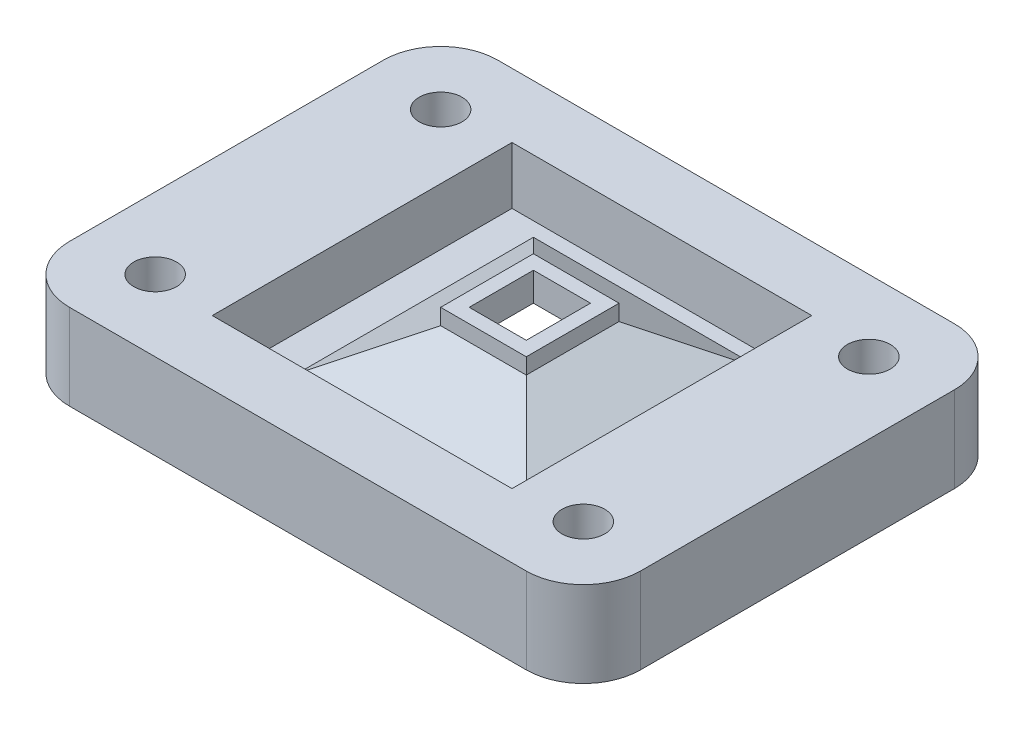
ISO-10303-21;
HEADER;
FILE_DESCRIPTION(('STEP AP214'),'2;1');
FILE_NAME('part.step','',(''),(''),'','','');
FILE_SCHEMA(('AUTOMOTIVE_DESIGN { 1 0 10303 214 1 1 1 1 }'));
ENDSEC;
DATA;
#1=APPLICATION_CONTEXT('core data for automotive mechanical design processes');
#2=APPLICATION_PROTOCOL_DEFINITION('international standard','automotive_design',2000,#1);
#3=PRODUCT_CONTEXT('',#1,'mechanical');
#4=PRODUCT('Part','Part','',(#3));
#5=PRODUCT_RELATED_PRODUCT_CATEGORY('part','',(#4));
#6=PRODUCT_DEFINITION_FORMATION('','',#4);
#7=PRODUCT_DEFINITION_CONTEXT('part definition',#1,'design');
#8=PRODUCT_DEFINITION('design','',#6,#7);
#9=PRODUCT_DEFINITION_SHAPE('','',#8);
#10=(LENGTH_UNIT() NAMED_UNIT(*) SI_UNIT(.MILLI.,.METRE.));
#11=(NAMED_UNIT(*) PLANE_ANGLE_UNIT() SI_UNIT($,.RADIAN.));
#12=(NAMED_UNIT(*) SI_UNIT($,.STERADIAN.) SOLID_ANGLE_UNIT());
#13=UNCERTAINTY_MEASURE_WITH_UNIT(LENGTH_MEASURE(1.E-05),#10,'distance_accuracy_value','');
#14=(GEOMETRIC_REPRESENTATION_CONTEXT(3) GLOBAL_UNCERTAINTY_ASSIGNED_CONTEXT((#13)) GLOBAL_UNIT_ASSIGNED_CONTEXT((#10,
#11,#12)) REPRESENTATION_CONTEXT('',''));
#15=CARTESIAN_POINT('',(0.,0.,0.));
#16=DIRECTION('',(0.,0.,1.));
#17=DIRECTION('',(1.,0.,0.));
#18=AXIS2_PLACEMENT_3D('',#15,#16,#17);
#19=CARTESIAN_POINT('',(0.,2.,0.));
#20=DIRECTION('',(0.,-1.,0.));
#21=DIRECTION('',(0.,0.,-1.));
#22=AXIS2_PLACEMENT_3D('',#19,#20,#21);
#23=PLANE('',#22);
#24=DIRECTION('',(-1.,0.,0.));
#25=VECTOR('',#24,1.);
#26=CARTESIAN_POINT('',(17.,2.,-8.00000000000003));
#27=LINE('',#26,#25);
#28=CARTESIAN_POINT('',(28.,2.,-8.00000000000003));
#29=VERTEX_POINT('',#28);
#30=CARTESIAN_POINT('',(12.,2.,-8.00000000000003));
#31=VERTEX_POINT('',#30);
#32=EDGE_CURVE('E394',#29,#31,#27,.T.);
#33=ORIENTED_EDGE('',*,*,#32,.T.);
#34=DIRECTION('',(0.,0.,-1.));
#35=VECTOR('',#34,1.);
#36=CARTESIAN_POINT('',(12.,2.,-19.5));
#37=LINE('',#36,#35);
#38=CARTESIAN_POINT('',(12.,2.,-24.5));
#39=VERTEX_POINT('',#38);
#40=EDGE_CURVE('E400',#31,#39,#37,.T.);
#41=ORIENTED_EDGE('',*,*,#40,.T.);
#42=DIRECTION('',(1.,0.,0.));
#43=VECTOR('',#42,1.);
#44=CARTESIAN_POINT('',(23.,2.,-24.5));
#45=LINE('',#44,#43);
#46=CARTESIAN_POINT('',(28.,2.,-24.5));
#47=VERTEX_POINT('',#46);
#48=EDGE_CURVE('E398',#39,#47,#45,.T.);
#49=ORIENTED_EDGE('',*,*,#48,.T.);
#50=DIRECTION('',(0.,0.,1.));
#51=VECTOR('',#50,1.);
#52=CARTESIAN_POINT('',(28.,2.,-13.));
#53=LINE('',#52,#51);
#54=EDGE_CURVE('E396',#47,#29,#53,.T.);
#55=ORIENTED_EDGE('',*,*,#54,.T.);
#56=EDGE_LOOP('',(#33,#41,#49,#55));
#57=FACE_BOUND('',#56,.T.);
#58=DIRECTION('',(0.,0.,1.));
#59=VECTOR('',#58,1.);
#60=CARTESIAN_POINT('',(9.5,2.,-4.5));
#61=LINE('',#60,#59);
#62=CARTESIAN_POINT('',(9.5,2.,-25.5));
#63=VERTEX_POINT('',#62);
#64=CARTESIAN_POINT('',(9.5,2.,-4.5));
#65=VERTEX_POINT('',#64);
#66=EDGE_CURVE('E251',#63,#65,#61,.T.);
#67=ORIENTED_EDGE('',*,*,#66,.T.);
#68=DIRECTION('',(1.,0.,0.));
#69=VECTOR('',#68,1.);
#70=CARTESIAN_POINT('',(9.5,2.,-4.5));
#71=LINE('',#70,#69);
#72=CARTESIAN_POINT('',(30.5,2.,-4.5));
#73=VERTEX_POINT('',#72);
#74=EDGE_CURVE('E254',#65,#73,#71,.T.);
#75=ORIENTED_EDGE('',*,*,#74,.T.);
#76=DIRECTION('',(0.,0.,-1.));
#77=VECTOR('',#76,1.);
#78=CARTESIAN_POINT('',(30.5,2.,-4.5));
#79=LINE('',#78,#77);
#80=CARTESIAN_POINT('',(30.5,2.,-25.5));
#81=VERTEX_POINT('',#80);
#82=EDGE_CURVE('E258',#73,#81,#79,.T.);
#83=ORIENTED_EDGE('',*,*,#82,.T.);
#84=DIRECTION('',(-1.,0.,0.));
#85=VECTOR('',#84,1.);
#86=CARTESIAN_POINT('',(9.5,2.,-25.5));
#87=LINE('',#86,#85);
#88=EDGE_CURVE('E261',#81,#63,#87,.T.);
#89=ORIENTED_EDGE('',*,*,#88,.T.);
#90=EDGE_LOOP('',(#67,#75,#83,#89));
#91=FACE_BOUND('',#90,.T.);
#92=ADVANCED_FACE('F33',(#57,#91),#23,.F.);
#93=CARTESIAN_POINT('',(0.,6.,0.));
#94=DIRECTION('',(1.,0.,0.));
#95=DIRECTION('',(0.,0.,-1.));
#96=AXIS2_PLACEMENT_3D('',#93,#94,#95);
#97=PLANE('',#96);
#98=DIRECTION('',(0.,0.,1.));
#99=VECTOR('',#98,1.);
#100=CARTESIAN_POINT('',(0.,6.,0.));
#101=LINE('',#100,#99);
#102=CARTESIAN_POINT('',(0.,6.,-26.));
#103=VERTEX_POINT('',#102);
#104=CARTESIAN_POINT('',(0.,6.,-4.));
#105=VERTEX_POINT('',#104);
#106=EDGE_CURVE('E307',#103,#105,#101,.T.);
#107=ORIENTED_EDGE('',*,*,#106,.F.);
#108=DIRECTION('',(0.,-1.,0.));
#109=VECTOR('',#108,1.);
#110=CARTESIAN_POINT('',(0.,6.,-26.));
#111=LINE('',#110,#109);
#112=CARTESIAN_POINT('',(0.,0.,-26.));
#113=VERTEX_POINT('',#112);
#114=EDGE_CURVE('E332',#103,#113,#111,.T.);
#115=ORIENTED_EDGE('',*,*,#114,.T.);
#116=DIRECTION('',(0.,0.,1.));
#117=VECTOR('',#116,1.);
#118=CARTESIAN_POINT('',(0.,0.,0.));
#119=LINE('',#118,#117);
#120=CARTESIAN_POINT('',(0.,0.,-4.));
#121=VERTEX_POINT('',#120);
#122=EDGE_CURVE('E306',#113,#121,#119,.T.);
#123=ORIENTED_EDGE('',*,*,#122,.T.);
#124=DIRECTION('',(0.,-1.,0.));
#125=VECTOR('',#124,1.);
#126=CARTESIAN_POINT('',(0.,6.,-4.));
#127=LINE('',#126,#125);
#128=EDGE_CURVE('E320',#121,#105,#127,.F.);
#129=ORIENTED_EDGE('',*,*,#128,.T.);
#130=EDGE_LOOP('',(#107,#115,#123,#129));
#131=FACE_BOUND('',#130,.T.);
#132=ADVANCED_FACE('F453',(#131),#97,.F.);
#133=CARTESIAN_POINT('',(0.,6.,0.));
#134=DIRECTION('',(0.,0.,-1.));
#135=DIRECTION('',(-1.,0.,0.));
#136=AXIS2_PLACEMENT_3D('',#133,#134,#135);
#137=PLANE('',#136);
#138=DIRECTION('',(1.,0.,0.));
#139=VECTOR('',#138,1.);
#140=CARTESIAN_POINT('',(0.,0.,0.));
#141=LINE('',#140,#139);
#142=CARTESIAN_POINT('',(4.,0.,0.));
#143=VERTEX_POINT('',#142);
#144=CARTESIAN_POINT('',(36.,0.,0.));
#145=VERTEX_POINT('',#144);
#146=EDGE_CURVE('E323',#143,#145,#141,.T.);
#147=ORIENTED_EDGE('',*,*,#146,.T.);
#148=DIRECTION('',(0.,-1.,0.));
#149=VECTOR('',#148,1.);
#150=CARTESIAN_POINT('',(36.,6.,0.));
#151=LINE('',#150,#149);
#152=CARTESIAN_POINT('',(36.,6.,0.));
#153=VERTEX_POINT('',#152);
#154=EDGE_CURVE('E364',#145,#153,#151,.F.);
#155=ORIENTED_EDGE('',*,*,#154,.T.);
#156=DIRECTION('',(1.,0.,0.));
#157=VECTOR('',#156,1.);
#158=CARTESIAN_POINT('',(0.,6.,0.));
#159=LINE('',#158,#157);
#160=CARTESIAN_POINT('',(4.,6.,0.));
#161=VERTEX_POINT('',#160);
#162=EDGE_CURVE('E310',#161,#153,#159,.T.);
#163=ORIENTED_EDGE('',*,*,#162,.F.);
#164=DIRECTION('',(0.,-1.,0.));
#165=VECTOR('',#164,1.);
#166=CARTESIAN_POINT('',(4.,6.,0.));
#167=LINE('',#166,#165);
#168=EDGE_CURVE('E361',#161,#143,#167,.T.);
#169=ORIENTED_EDGE('',*,*,#168,.T.);
#170=EDGE_LOOP('',(#147,#155,#163,#169));
#171=FACE_BOUND('',#170,.T.);
#172=ADVANCED_FACE('F460',(#171),#137,.F.);
#173=CARTESIAN_POINT('',(40.,6.,0.));
#174=DIRECTION('',(-1.,0.,0.));
#175=DIRECTION('',(0.,0.,1.));
#176=AXIS2_PLACEMENT_3D('',#173,#174,#175);
#177=PLANE('',#176);
#178=DIRECTION('',(0.,0.,-1.));
#179=VECTOR('',#178,1.);
#180=CARTESIAN_POINT('',(40.,0.,0.));
#181=LINE('',#180,#179);
#182=CARTESIAN_POINT('',(40.,0.,-4.));
#183=VERTEX_POINT('',#182);
#184=CARTESIAN_POINT('',(40.,0.,-26.));
#185=VERTEX_POINT('',#184);
#186=EDGE_CURVE('E326',#183,#185,#181,.T.);
#187=ORIENTED_EDGE('',*,*,#186,.T.);
#188=DIRECTION('',(0.,-1.,0.));
#189=VECTOR('',#188,1.);
#190=CARTESIAN_POINT('',(40.,6.,-26.));
#191=LINE('',#190,#189);
#192=CARTESIAN_POINT('',(40.,6.,-26.));
#193=VERTEX_POINT('',#192);
#194=EDGE_CURVE('E359',#185,#193,#191,.F.);
#195=ORIENTED_EDGE('',*,*,#194,.T.);
#196=DIRECTION('',(0.,0.,-1.));
#197=VECTOR('',#196,1.);
#198=CARTESIAN_POINT('',(40.,6.,0.));
#199=LINE('',#198,#197);
#200=CARTESIAN_POINT('',(40.,6.,-4.));
#201=VERTEX_POINT('',#200);
#202=EDGE_CURVE('E314',#201,#193,#199,.T.);
#203=ORIENTED_EDGE('',*,*,#202,.F.);
#204=DIRECTION('',(0.,-1.,0.));
#205=VECTOR('',#204,1.);
#206=CARTESIAN_POINT('',(40.,6.,-4.));
#207=LINE('',#206,#205);
#208=EDGE_CURVE('E356',#201,#183,#207,.T.);
#209=ORIENTED_EDGE('',*,*,#208,.T.);
#210=EDGE_LOOP('',(#187,#195,#203,#209));
#211=FACE_BOUND('',#210,.T.);
#212=ADVANCED_FACE('F511',(#211),#177,.F.);
#213=CARTESIAN_POINT('',(0.,6.,-30.));
#214=DIRECTION('',(0.,0.,1.));
#215=DIRECTION('',(1.,0.,0.));
#216=AXIS2_PLACEMENT_3D('',#213,#214,#215);
#217=PLANE('',#216);
#218=DIRECTION('',(-1.,0.,0.));
#219=VECTOR('',#218,1.);
#220=CARTESIAN_POINT('',(0.,0.,-30.));
#221=LINE('',#220,#219);
#222=CARTESIAN_POINT('',(36.,0.,-30.));
#223=VERTEX_POINT('',#222);
#224=CARTESIAN_POINT('',(4.,0.,-30.));
#225=VERTEX_POINT('',#224);
#226=EDGE_CURVE('E311',#223,#225,#221,.T.);
#227=ORIENTED_EDGE('',*,*,#226,.T.);
#228=DIRECTION('',(0.,-1.,0.));
#229=VECTOR('',#228,1.);
#230=CARTESIAN_POINT('',(4.,6.,-30.));
#231=LINE('',#230,#229);
#232=CARTESIAN_POINT('',(4.,6.,-30.));
#233=VERTEX_POINT('',#232);
#234=EDGE_CURVE('E346',#225,#233,#231,.F.);
#235=ORIENTED_EDGE('',*,*,#234,.T.);
#236=DIRECTION('',(-1.,0.,0.));
#237=VECTOR('',#236,1.);
#238=CARTESIAN_POINT('',(0.,6.,-30.));
#239=LINE('',#238,#237);
#240=CARTESIAN_POINT('',(36.,6.,-30.));
#241=VERTEX_POINT('',#240);
#242=EDGE_CURVE('E317',#241,#233,#239,.T.);
#243=ORIENTED_EDGE('',*,*,#242,.F.);
#244=DIRECTION('',(0.,-1.,0.));
#245=VECTOR('',#244,1.);
#246=CARTESIAN_POINT('',(36.,6.,-30.));
#247=LINE('',#246,#245);
#248=EDGE_CURVE('E343',#241,#223,#247,.T.);
#249=ORIENTED_EDGE('',*,*,#248,.T.);
#250=EDGE_LOOP('',(#227,#235,#243,#249));
#251=FACE_BOUND('',#250,.T.);
#252=ADVANCED_FACE('F504',(#251),#217,.F.);
#253=CARTESIAN_POINT('',(0.,6.,0.));
#254=DIRECTION('',(0.,-1.,0.));
#255=DIRECTION('',(0.,0.,-1.));
#256=AXIS2_PLACEMENT_3D('',#253,#254,#255);
#257=PLANE('',#256);
#258=DIRECTION('',(1.,0.,0.));
#259=VECTOR('',#258,1.);
#260=CARTESIAN_POINT('',(9.5,6.,-4.5));
#261=LINE('',#260,#259);
#262=CARTESIAN_POINT('',(9.5,6.,-4.5));
#263=VERTEX_POINT('',#262);
#264=CARTESIAN_POINT('',(30.5,6.,-4.5));
#265=VERTEX_POINT('',#264);
#266=EDGE_CURVE('E266',#263,#265,#261,.T.);
#267=ORIENTED_EDGE('',*,*,#266,.F.);
#268=DIRECTION('',(0.,0.,1.));
#269=VECTOR('',#268,1.);
#270=CARTESIAN_POINT('',(9.5,6.,-4.5));
#271=LINE('',#270,#269);
#272=CARTESIAN_POINT('',(9.5,6.,-25.5));
#273=VERTEX_POINT('',#272);
#274=EDGE_CURVE('E208',#273,#263,#271,.T.);
#275=ORIENTED_EDGE('',*,*,#274,.F.);
#276=DIRECTION('',(-1.,0.,0.));
#277=VECTOR('',#276,1.);
#278=CARTESIAN_POINT('',(9.5,6.,-25.5));
#279=LINE('',#278,#277);
#280=CARTESIAN_POINT('',(30.5,6.,-25.5));
#281=VERTEX_POINT('',#280);
#282=EDGE_CURVE('E255',#281,#273,#279,.T.);
#283=ORIENTED_EDGE('',*,*,#282,.F.);
#284=DIRECTION('',(0.,0.,-1.));
#285=VECTOR('',#284,1.);
#286=CARTESIAN_POINT('',(30.5,6.,-4.5));
#287=LINE('',#286,#285);
#288=EDGE_CURVE('E269',#265,#281,#287,.T.);
#289=ORIENTED_EDGE('',*,*,#288,.F.);
#290=EDGE_LOOP('',(#267,#275,#283,#289));
#291=FACE_BOUND('',#290,.T.);
#292=CARTESIAN_POINT('',(5.,6.,-25.));
#293=DIRECTION('',(0.,1.,0.));
#294=DIRECTION('',(0.,0.,-1.));
#295=AXIS2_PLACEMENT_3D('',#292,#293,#294);
#296=CIRCLE('',#295,1.5);
#297=CARTESIAN_POINT('',(5.,6.,-26.5));
#298=VERTEX_POINT('',#297);
#299=EDGE_CURVE('E283',#298,#298,#296,.T.);
#300=ORIENTED_EDGE('',*,*,#299,.F.);
#301=EDGE_LOOP('',(#300));
#302=FACE_BOUND('',#301,.T.);
#303=CARTESIAN_POINT('',(35.,6.,-5.));
#304=DIRECTION('',(0.,1.,0.));
#305=DIRECTION('',(0.,0.,-1.));
#306=AXIS2_PLACEMENT_3D('',#303,#304,#305);
#307=CIRCLE('',#306,1.5);
#308=CARTESIAN_POINT('',(35.,6.,-6.5));
#309=VERTEX_POINT('',#308);
#310=EDGE_CURVE('E291',#309,#309,#307,.T.);
#311=ORIENTED_EDGE('',*,*,#310,.F.);
#312=EDGE_LOOP('',(#311));
#313=FACE_BOUND('',#312,.T.);
#314=CARTESIAN_POINT('',(35.,6.,-25.));
#315=DIRECTION('',(0.,1.,0.));
#316=DIRECTION('',(0.,0.,1.));
#317=AXIS2_PLACEMENT_3D('',#314,#315,#316);
#318=CIRCLE('',#317,1.5);
#319=CARTESIAN_POINT('',(35.,6.,-23.5));
#320=VERTEX_POINT('',#319);
#321=EDGE_CURVE('E276',#320,#320,#318,.T.);
#322=ORIENTED_EDGE('',*,*,#321,.F.);
#323=EDGE_LOOP('',(#322));
#324=FACE_BOUND('',#323,.T.);
#325=CARTESIAN_POINT('',(5.,6.,-5.));
#326=DIRECTION('',(0.,1.,0.));
#327=DIRECTION('',(0.,0.,1.));
#328=AXIS2_PLACEMENT_3D('',#325,#326,#327);
#329=CIRCLE('',#328,1.5);
#330=CARTESIAN_POINT('',(5.,6.,-3.5));
#331=VERTEX_POINT('',#330);
#332=EDGE_CURVE('E290',#331,#331,#329,.T.);
#333=ORIENTED_EDGE('',*,*,#332,.F.);
#334=EDGE_LOOP('',(#333));
#335=FACE_BOUND('',#334,.T.);
#336=ORIENTED_EDGE('',*,*,#242,.T.);
#337=CARTESIAN_POINT('',(4.,6.,-26.));
#338=DIRECTION('',(0.,-1.,0.));
#339=DIRECTION('',(0.,0.,-1.));
#340=AXIS2_PLACEMENT_3D('',#337,#338,#339);
#341=CIRCLE('',#340,4.);
#342=EDGE_CURVE('E354',#233,#103,#341,.F.);
#343=ORIENTED_EDGE('',*,*,#342,.T.);
#344=ORIENTED_EDGE('',*,*,#106,.T.);
#345=CARTESIAN_POINT('',(4.,6.,-4.));
#346=DIRECTION('',(0.,-1.,0.));
#347=DIRECTION('',(0.,0.,-1.));
#348=AXIS2_PLACEMENT_3D('',#345,#346,#347);
#349=CIRCLE('',#348,4.);
#350=EDGE_CURVE('E348',#105,#161,#349,.F.);
#351=ORIENTED_EDGE('',*,*,#350,.T.);
#352=ORIENTED_EDGE('',*,*,#162,.T.);
#353=CARTESIAN_POINT('',(36.,6.,-4.));
#354=DIRECTION('',(0.,-1.,0.));
#355=DIRECTION('',(0.,0.,-1.));
#356=AXIS2_PLACEMENT_3D('',#353,#354,#355);
#357=CIRCLE('',#356,4.);
#358=EDGE_CURVE('E350',#153,#201,#357,.F.);
#359=ORIENTED_EDGE('',*,*,#358,.T.);
#360=ORIENTED_EDGE('',*,*,#202,.T.);
#361=CARTESIAN_POINT('',(36.,6.,-26.));
#362=DIRECTION('',(0.,-1.,0.));
#363=DIRECTION('',(0.,0.,-1.));
#364=AXIS2_PLACEMENT_3D('',#361,#362,#363);
#365=CIRCLE('',#364,4.);
#366=EDGE_CURVE('E352',#193,#241,#365,.F.);
#367=ORIENTED_EDGE('',*,*,#366,.T.);
#368=EDGE_LOOP('',(#336,#343,#344,#351,#352,#359,#360,#367));
#369=FACE_BOUND('',#368,.T.);
#370=ADVANCED_FACE('F501',(#291,#302,#313,#324,#335,#369),#257,.F.);
#371=CARTESIAN_POINT('',(0.,0.,0.));
#372=DIRECTION('',(0.,-1.,0.));
#373=DIRECTION('',(0.,0.,-1.));
#374=AXIS2_PLACEMENT_3D('',#371,#372,#373);
#375=PLANE('',#374);
#376=DIRECTION('',(-1.,0.,0.));
#377=VECTOR('',#376,1.);
#378=CARTESIAN_POINT('',(18.,0.,-25.4282032302755));
#379=LINE('',#378,#377);
#380=CARTESIAN_POINT('',(28.9282032302755,0.,-25.4282032302755));
#381=VERTEX_POINT('',#380);
#382=CARTESIAN_POINT('',(11.0717967697245,0.,-25.4282032302755));
#383=VERTEX_POINT('',#382);
#384=EDGE_CURVE('E366',#381,#383,#379,.T.);
#385=ORIENTED_EDGE('',*,*,#384,.T.);
#386=DIRECTION('',(0.,0.,1.));
#387=VECTOR('',#386,1.);
#388=CARTESIAN_POINT('',(11.0717967697245,0.,-14.));
#389=LINE('',#388,#387);
#390=CARTESIAN_POINT('',(11.0717967697245,0.,-7.0717967697245));
#391=VERTEX_POINT('',#390);
#392=EDGE_CURVE('E372',#383,#391,#389,.T.);
#393=ORIENTED_EDGE('',*,*,#392,.T.);
#394=DIRECTION('',(1.,0.,0.));
#395=VECTOR('',#394,1.);
#396=CARTESIAN_POINT('',(22.,0.,-7.0717967697245));
#397=LINE('',#396,#395);
#398=CARTESIAN_POINT('',(28.9282032302755,0.,-7.0717967697245));
#399=VERTEX_POINT('',#398);
#400=EDGE_CURVE('E370',#391,#399,#397,.T.);
#401=ORIENTED_EDGE('',*,*,#400,.T.);
#402=DIRECTION('',(0.,0.,-1.));
#403=VECTOR('',#402,1.);
#404=CARTESIAN_POINT('',(28.9282032302755,0.,-18.5));
#405=LINE('',#404,#403);
#406=EDGE_CURVE('E368',#399,#381,#405,.T.);
#407=ORIENTED_EDGE('',*,*,#406,.T.);
#408=EDGE_LOOP('',(#385,#393,#401,#407));
#409=FACE_BOUND('',#408,.T.);
#410=CARTESIAN_POINT('',(5.,0.,-25.));
#411=DIRECTION('',(0.,-1.,0.));
#412=DIRECTION('',(0.,0.,-1.));
#413=AXIS2_PLACEMENT_3D('',#410,#411,#412);
#414=CIRCLE('',#413,1.5);
#415=CARTESIAN_POINT('',(5.,0.,-26.5));
#416=VERTEX_POINT('',#415);
#417=EDGE_CURVE('E286',#416,#416,#414,.F.);
#418=ORIENTED_EDGE('',*,*,#417,.T.);
#419=EDGE_LOOP('',(#418));
#420=FACE_BOUND('',#419,.T.);
#421=CARTESIAN_POINT('',(35.,0.,-5.));
#422=DIRECTION('',(0.,-1.,0.));
#423=DIRECTION('',(0.,0.,-1.));
#424=AXIS2_PLACEMENT_3D('',#421,#422,#423);
#425=CIRCLE('',#424,1.5);
#426=CARTESIAN_POINT('',(35.,0.,-6.5));
#427=VERTEX_POINT('',#426);
#428=EDGE_CURVE('E287',#427,#427,#425,.F.);
#429=ORIENTED_EDGE('',*,*,#428,.T.);
#430=EDGE_LOOP('',(#429));
#431=FACE_BOUND('',#430,.T.);
#432=CARTESIAN_POINT('',(35.,0.,-25.));
#433=DIRECTION('',(0.,-1.,0.));
#434=DIRECTION('',(0.,0.,-1.));
#435=AXIS2_PLACEMENT_3D('',#432,#433,#434);
#436=CIRCLE('',#435,1.5);
#437=CARTESIAN_POINT('',(35.,0.,-26.5));
#438=VERTEX_POINT('',#437);
#439=EDGE_CURVE('E294',#438,#438,#436,.F.);
#440=ORIENTED_EDGE('',*,*,#439,.T.);
#441=EDGE_LOOP('',(#440));
#442=FACE_BOUND('',#441,.T.);
#443=CARTESIAN_POINT('',(5.,0.,-5.));
#444=DIRECTION('',(0.,-1.,0.));
#445=DIRECTION('',(0.,0.,-1.));
#446=AXIS2_PLACEMENT_3D('',#443,#444,#445);
#447=CIRCLE('',#446,1.5);
#448=CARTESIAN_POINT('',(5.,0.,-6.5));
#449=VERTEX_POINT('',#448);
#450=EDGE_CURVE('E303',#449,#449,#447,.F.);
#451=ORIENTED_EDGE('',*,*,#450,.T.);
#452=EDGE_LOOP('',(#451));
#453=FACE_BOUND('',#452,.T.);
#454=ORIENTED_EDGE('',*,*,#122,.F.);
#455=CARTESIAN_POINT('',(4.,0.,-26.));
#456=DIRECTION('',(0.,-1.,0.));
#457=DIRECTION('',(0.,0.,-1.));
#458=AXIS2_PLACEMENT_3D('',#455,#456,#457);
#459=CIRCLE('',#458,4.);
#460=EDGE_CURVE('E341',#113,#225,#459,.T.);
#461=ORIENTED_EDGE('',*,*,#460,.T.);
#462=ORIENTED_EDGE('',*,*,#226,.F.);
#463=CARTESIAN_POINT('',(36.,0.,-26.));
#464=DIRECTION('',(0.,-1.,0.));
#465=DIRECTION('',(0.,0.,-1.));
#466=AXIS2_PLACEMENT_3D('',#463,#464,#465);
#467=CIRCLE('',#466,4.);
#468=EDGE_CURVE('E339',#223,#185,#467,.T.);
#469=ORIENTED_EDGE('',*,*,#468,.T.);
#470=ORIENTED_EDGE('',*,*,#186,.F.);
#471=CARTESIAN_POINT('',(36.,0.,-4.));
#472=DIRECTION('',(0.,-1.,0.));
#473=DIRECTION('',(0.,0.,-1.));
#474=AXIS2_PLACEMENT_3D('',#471,#472,#473);
#475=CIRCLE('',#474,4.);
#476=EDGE_CURVE('E337',#183,#145,#475,.T.);
#477=ORIENTED_EDGE('',*,*,#476,.T.);
#478=ORIENTED_EDGE('',*,*,#146,.F.);
#479=CARTESIAN_POINT('',(4.,0.,-4.));
#480=DIRECTION('',(0.,-1.,0.));
#481=DIRECTION('',(0.,0.,-1.));
#482=AXIS2_PLACEMENT_3D('',#479,#480,#481);
#483=CIRCLE('',#482,4.);
#484=EDGE_CURVE('E335',#143,#121,#483,.T.);
#485=ORIENTED_EDGE('',*,*,#484,.T.);
#486=EDGE_LOOP('',(#454,#461,#462,#469,#470,#477,#478,#485));
#487=FACE_BOUND('',#486,.T.);
#488=ADVANCED_FACE('F499',(#409,#420,#431,#442,#453,#487),#375,.T.);
#489=CARTESIAN_POINT('',(5.,-4.24264068711928,-5.));
#490=DIRECTION('',(0.,1.,0.));
#491=DIRECTION('',(0.,0.,1.));
#492=AXIS2_PLACEMENT_3D('',#489,#490,#491);
#493=CYLINDRICAL_SURFACE('',#492,1.5);
#494=ORIENTED_EDGE('',*,*,#332,.T.);
#495=EDGE_LOOP('',(#494));
#496=FACE_BOUND('',#495,.T.);
#497=ORIENTED_EDGE('',*,*,#450,.F.);
#498=EDGE_LOOP('',(#497));
#499=FACE_BOUND('',#498,.T.);
#500=ADVANCED_FACE('F495',(#496,#499),#493,.F.);
#501=CARTESIAN_POINT('',(35.,-4.24264068711928,-25.));
#502=DIRECTION('',(0.,1.,0.));
#503=DIRECTION('',(0.,0.,1.));
#504=AXIS2_PLACEMENT_3D('',#501,#502,#503);
#505=CYLINDRICAL_SURFACE('',#504,1.5);
#506=ORIENTED_EDGE('',*,*,#321,.T.);
#507=EDGE_LOOP('',(#506));
#508=FACE_BOUND('',#507,.T.);
#509=ORIENTED_EDGE('',*,*,#439,.F.);
#510=EDGE_LOOP('',(#509));
#511=FACE_BOUND('',#510,.T.);
#512=ADVANCED_FACE('F491',(#508,#511),#505,.F.);
#513=CARTESIAN_POINT('',(35.,-4.24264068711928,-5.));
#514=DIRECTION('',(0.,1.,0.));
#515=DIRECTION('',(0.,0.,1.));
#516=AXIS2_PLACEMENT_3D('',#513,#514,#515);
#517=CYLINDRICAL_SURFACE('',#516,1.5);
#518=ORIENTED_EDGE('',*,*,#310,.T.);
#519=EDGE_LOOP('',(#518));
#520=FACE_BOUND('',#519,.T.);
#521=ORIENTED_EDGE('',*,*,#428,.F.);
#522=EDGE_LOOP('',(#521));
#523=FACE_BOUND('',#522,.T.);
#524=ADVANCED_FACE('F487',(#520,#523),#517,.F.);
#525=CARTESIAN_POINT('',(5.,-4.24264068711928,-25.));
#526=DIRECTION('',(0.,1.,0.));
#527=DIRECTION('',(0.,0.,1.));
#528=AXIS2_PLACEMENT_3D('',#525,#526,#527);
#529=CYLINDRICAL_SURFACE('',#528,1.5);
#530=ORIENTED_EDGE('',*,*,#299,.T.);
#531=EDGE_LOOP('',(#530));
#532=FACE_BOUND('',#531,.T.);
#533=ORIENTED_EDGE('',*,*,#417,.F.);
#534=EDGE_LOOP('',(#533));
#535=FACE_BOUND('',#534,.T.);
#536=ADVANCED_FACE('F483',(#532,#535),#529,.F.);
#537=CARTESIAN_POINT('',(4.,6.,-26.));
#538=DIRECTION('',(0.,-1.,0.));
#539=DIRECTION('',(0.,0.,-1.));
#540=AXIS2_PLACEMENT_3D('',#537,#538,#539);
#541=CYLINDRICAL_SURFACE('',#540,4.);
#542=ORIENTED_EDGE('',*,*,#342,.F.);
#543=ORIENTED_EDGE('',*,*,#234,.F.);
#544=ORIENTED_EDGE('',*,*,#460,.F.);
#545=ORIENTED_EDGE('',*,*,#114,.F.);
#546=EDGE_LOOP('',(#542,#543,#544,#545));
#547=FACE_BOUND('',#546,.T.);
#548=ADVANCED_FACE('F486',(#547),#541,.T.);
#549=CARTESIAN_POINT('',(36.,6.,-26.));
#550=DIRECTION('',(0.,-1.,0.));
#551=DIRECTION('',(0.,0.,-1.));
#552=AXIS2_PLACEMENT_3D('',#549,#550,#551);
#553=CYLINDRICAL_SURFACE('',#552,4.);
#554=ORIENTED_EDGE('',*,*,#366,.F.);
#555=ORIENTED_EDGE('',*,*,#194,.F.);
#556=ORIENTED_EDGE('',*,*,#468,.F.);
#557=ORIENTED_EDGE('',*,*,#248,.F.);
#558=EDGE_LOOP('',(#554,#555,#556,#557));
#559=FACE_BOUND('',#558,.T.);
#560=ADVANCED_FACE('F521',(#559),#553,.T.);
#561=CARTESIAN_POINT('',(36.,6.,-4.));
#562=DIRECTION('',(0.,-1.,0.));
#563=DIRECTION('',(0.,0.,-1.));
#564=AXIS2_PLACEMENT_3D('',#561,#562,#563);
#565=CYLINDRICAL_SURFACE('',#564,4.);
#566=ORIENTED_EDGE('',*,*,#358,.F.);
#567=ORIENTED_EDGE('',*,*,#154,.F.);
#568=ORIENTED_EDGE('',*,*,#476,.F.);
#569=ORIENTED_EDGE('',*,*,#208,.F.);
#570=EDGE_LOOP('',(#566,#567,#568,#569));
#571=FACE_BOUND('',#570,.T.);
#572=ADVANCED_FACE('F525',(#571),#565,.T.);
#573=CARTESIAN_POINT('',(4.,6.,-4.));
#574=DIRECTION('',(0.,-1.,0.));
#575=DIRECTION('',(0.,0.,-1.));
#576=AXIS2_PLACEMENT_3D('',#573,#574,#575);
#577=CYLINDRICAL_SURFACE('',#576,4.);
#578=ORIENTED_EDGE('',*,*,#350,.F.);
#579=ORIENTED_EDGE('',*,*,#128,.F.);
#580=ORIENTED_EDGE('',*,*,#484,.F.);
#581=ORIENTED_EDGE('',*,*,#168,.F.);
#582=EDGE_LOOP('',(#578,#579,#580,#581));
#583=FACE_BOUND('',#582,.T.);
#584=ADVANCED_FACE('F481',(#583),#577,.T.);
#585=CARTESIAN_POINT('',(9.5,2.,-4.5));
#586=DIRECTION('',(-1.,0.,0.));
#587=DIRECTION('',(0.,0.,1.));
#588=AXIS2_PLACEMENT_3D('',#585,#586,#587);
#589=PLANE('',#588);
#590=ORIENTED_EDGE('',*,*,#274,.T.);
#591=DIRECTION('',(0.,1.,0.));
#592=VECTOR('',#591,1.);
#593=CARTESIAN_POINT('',(9.5,2.,-4.5));
#594=LINE('',#593,#592);
#595=EDGE_CURVE('E264',#65,#263,#594,.T.);
#596=ORIENTED_EDGE('',*,*,#595,.F.);
#597=ORIENTED_EDGE('',*,*,#66,.F.);
#598=DIRECTION('',(0.,1.,0.));
#599=VECTOR('',#598,1.);
#600=CARTESIAN_POINT('',(9.5,2.,-25.5));
#601=LINE('',#600,#599);
#602=EDGE_CURVE('E274',#63,#273,#601,.T.);
#603=ORIENTED_EDGE('',*,*,#602,.T.);
#604=EDGE_LOOP('',(#590,#596,#597,#603));
#605=FACE_BOUND('',#604,.T.);
#606=ADVANCED_FACE('F470',(#605),#589,.F.);
#607=CARTESIAN_POINT('',(9.5,2.,-25.5));
#608=DIRECTION('',(0.,0.,-1.));
#609=DIRECTION('',(-1.,0.,0.));
#610=AXIS2_PLACEMENT_3D('',#607,#608,#609);
#611=PLANE('',#610);
#612=ORIENTED_EDGE('',*,*,#282,.T.);
#613=ORIENTED_EDGE('',*,*,#602,.F.);
#614=ORIENTED_EDGE('',*,*,#88,.F.);
#615=DIRECTION('',(0.,1.,0.));
#616=VECTOR('',#615,1.);
#617=CARTESIAN_POINT('',(30.5,2.,-25.5));
#618=LINE('',#617,#616);
#619=EDGE_CURVE('E277',#81,#281,#618,.T.);
#620=ORIENTED_EDGE('',*,*,#619,.T.);
#621=EDGE_LOOP('',(#612,#613,#614,#620));
#622=FACE_BOUND('',#621,.T.);
#623=ADVANCED_FACE('F466',(#622),#611,.F.);
#624=CARTESIAN_POINT('',(30.5,2.,-4.5));
#625=DIRECTION('',(1.,0.,0.));
#626=DIRECTION('',(0.,0.,-1.));
#627=AXIS2_PLACEMENT_3D('',#624,#625,#626);
#628=PLANE('',#627);
#629=ORIENTED_EDGE('',*,*,#288,.T.);
#630=ORIENTED_EDGE('',*,*,#619,.F.);
#631=ORIENTED_EDGE('',*,*,#82,.F.);
#632=DIRECTION('',(0.,1.,0.));
#633=VECTOR('',#632,1.);
#634=CARTESIAN_POINT('',(30.5,2.,-4.5));
#635=LINE('',#634,#633);
#636=EDGE_CURVE('E279',#73,#265,#635,.T.);
#637=ORIENTED_EDGE('',*,*,#636,.T.);
#638=EDGE_LOOP('',(#629,#630,#631,#637));
#639=FACE_BOUND('',#638,.T.);
#640=ADVANCED_FACE('F469',(#639),#628,.F.);
#641=CARTESIAN_POINT('',(9.5,2.,-4.5));
#642=DIRECTION('',(0.,0.,1.));
#643=DIRECTION('',(1.,0.,0.));
#644=AXIS2_PLACEMENT_3D('',#641,#642,#643);
#645=PLANE('',#644);
#646=ORIENTED_EDGE('',*,*,#266,.T.);
#647=ORIENTED_EDGE('',*,*,#636,.F.);
#648=ORIENTED_EDGE('',*,*,#74,.F.);
#649=ORIENTED_EDGE('',*,*,#595,.T.);
#650=EDGE_LOOP('',(#646,#647,#648,#649));
#651=FACE_BOUND('',#650,.T.);
#652=ADVANCED_FACE('F474',(#651),#645,.F.);
#653=CARTESIAN_POINT('',(18.,-6.02079728939615,-14.));
#654=DIRECTION('',(0.,0.,1.));
#655=DIRECTION('',(1.,0.,0.));
#656=AXIS2_PLACEMENT_3D('',#653,#654,#655);
#657=PLANE('',#656);
#658=DIRECTION('',(0.,1.,0.));
#659=VECTOR('',#658,1.);
#660=CARTESIAN_POINT('',(22.,-6.02079728939615,-14.));
#661=LINE('',#660,#659);
#662=CARTESIAN_POINT('',(22.,4.00000000000001,-14.));
#663=VERTEX_POINT('',#662);
#664=CARTESIAN_POINT('',(22.,6.,-14.));
#665=VERTEX_POINT('',#664);
#666=EDGE_CURVE('E246',#663,#665,#661,.T.);
#667=ORIENTED_EDGE('',*,*,#666,.F.);
#668=DIRECTION('',(-1.,0.,0.));
#669=VECTOR('',#668,1.);
#670=CARTESIAN_POINT('',(18.,4.00000000000001,-14.));
#671=LINE('',#670,#669);
#672=CARTESIAN_POINT('',(18.,4.00000000000001,-14.));
#673=VERTEX_POINT('',#672);
#674=EDGE_CURVE('E204',#663,#673,#671,.T.);
#675=ORIENTED_EDGE('',*,*,#674,.T.);
#676=DIRECTION('',(0.,1.,0.));
#677=VECTOR('',#676,1.);
#678=CARTESIAN_POINT('',(18.,-6.02079728939615,-14.));
#679=LINE('',#678,#677);
#680=CARTESIAN_POINT('',(18.,6.,-14.));
#681=VERTEX_POINT('',#680);
#682=EDGE_CURVE('E196',#673,#681,#679,.T.);
#683=ORIENTED_EDGE('',*,*,#682,.T.);
#684=DIRECTION('',(1.,0.,0.));
#685=VECTOR('',#684,1.);
#686=CARTESIAN_POINT('',(18.,6.,-14.));
#687=LINE('',#686,#685);
#688=EDGE_CURVE('E201',#681,#665,#687,.T.);
#689=ORIENTED_EDGE('',*,*,#688,.T.);
#690=EDGE_LOOP('',(#667,#675,#683,#689));
#691=FACE_BOUND('',#690,.T.);
#692=ADVANCED_FACE('F199',(#691),#657,.F.);
#693=CARTESIAN_POINT('',(22.,-6.02079728939615,-14.));
#694=DIRECTION('',(1.,0.,0.));
#695=DIRECTION('',(0.,0.,-1.));
#696=AXIS2_PLACEMENT_3D('',#693,#694,#695);
#697=PLANE('',#696);
#698=DIRECTION('',(0.,1.,0.));
#699=VECTOR('',#698,1.);
#700=CARTESIAN_POINT('',(22.,-6.02079728939615,-18.5));
#701=LINE('',#700,#699);
#702=CARTESIAN_POINT('',(22.,4.00000000000001,-18.5));
#703=VERTEX_POINT('',#702);
#704=CARTESIAN_POINT('',(22.,6.,-18.5));
#705=VERTEX_POINT('',#704);
#706=EDGE_CURVE('E248',#703,#705,#701,.T.);
#707=ORIENTED_EDGE('',*,*,#706,.F.);
#708=DIRECTION('',(0.,0.,1.));
#709=VECTOR('',#708,1.);
#710=CARTESIAN_POINT('',(22.,4.00000000000001,-14.));
#711=LINE('',#710,#709);
#712=EDGE_CURVE('E378',#703,#663,#711,.T.);
#713=ORIENTED_EDGE('',*,*,#712,.T.);
#714=ORIENTED_EDGE('',*,*,#666,.T.);
#715=DIRECTION('',(0.,0.,-1.));
#716=VECTOR('',#715,1.);
#717=CARTESIAN_POINT('',(22.,6.,-18.5));
#718=LINE('',#717,#716);
#719=EDGE_CURVE('E222',#665,#705,#718,.T.);
#720=ORIENTED_EDGE('',*,*,#719,.T.);
#721=EDGE_LOOP('',(#707,#713,#714,#720));
#722=FACE_BOUND('',#721,.T.);
#723=ADVANCED_FACE('F615',(#722),#697,.F.);
#724=CARTESIAN_POINT('',(18.,-6.02079728939615,-18.5));
#725=DIRECTION('',(0.,0.,-1.));
#726=DIRECTION('',(-1.,0.,0.));
#727=AXIS2_PLACEMENT_3D('',#724,#725,#726);
#728=PLANE('',#727);
#729=DIRECTION('',(0.,1.,0.));
#730=VECTOR('',#729,1.);
#731=CARTESIAN_POINT('',(18.,-6.02079728939615,-18.5));
#732=LINE('',#731,#730);
#733=CARTESIAN_POINT('',(18.,4.00000000000001,-18.5));
#734=VERTEX_POINT('',#733);
#735=CARTESIAN_POINT('',(18.,6.,-18.5));
#736=VERTEX_POINT('',#735);
#737=EDGE_CURVE('E209',#734,#736,#732,.T.);
#738=ORIENTED_EDGE('',*,*,#737,.F.);
#739=DIRECTION('',(1.,0.,0.));
#740=VECTOR('',#739,1.);
#741=CARTESIAN_POINT('',(22.,4.00000000000001,-18.5));
#742=LINE('',#741,#740);
#743=EDGE_CURVE('E380',#734,#703,#742,.T.);
#744=ORIENTED_EDGE('',*,*,#743,.T.);
#745=ORIENTED_EDGE('',*,*,#706,.T.);
#746=DIRECTION('',(-1.,0.,0.));
#747=VECTOR('',#746,1.);
#748=CARTESIAN_POINT('',(18.,6.,-18.5));
#749=LINE('',#748,#747);
#750=EDGE_CURVE('E224',#705,#736,#749,.T.);
#751=ORIENTED_EDGE('',*,*,#750,.T.);
#752=EDGE_LOOP('',(#738,#744,#745,#751));
#753=FACE_BOUND('',#752,.T.);
#754=ADVANCED_FACE('F608',(#753),#728,.F.);
#755=CARTESIAN_POINT('',(18.,-6.02079728939615,-14.));
#756=DIRECTION('',(-1.,0.,0.));
#757=DIRECTION('',(0.,0.,1.));
#758=AXIS2_PLACEMENT_3D('',#755,#756,#757);
#759=PLANE('',#758);
#760=ORIENTED_EDGE('',*,*,#682,.F.);
#761=DIRECTION('',(0.,0.,-1.));
#762=VECTOR('',#761,1.);
#763=CARTESIAN_POINT('',(18.,4.00000000000001,-18.5));
#764=LINE('',#763,#762);
#765=EDGE_CURVE('E375',#673,#734,#764,.T.);
#766=ORIENTED_EDGE('',*,*,#765,.T.);
#767=ORIENTED_EDGE('',*,*,#737,.T.);
#768=DIRECTION('',(0.,0.,1.));
#769=VECTOR('',#768,1.);
#770=CARTESIAN_POINT('',(18.,6.,-18.5));
#771=LINE('',#770,#769);
#772=EDGE_CURVE('E212',#736,#681,#771,.T.);
#773=ORIENTED_EDGE('',*,*,#772,.T.);
#774=EDGE_LOOP('',(#760,#766,#767,#773));
#775=FACE_BOUND('',#774,.T.);
#776=ADVANCED_FACE('F213',(#775),#759,.F.);
#777=CARTESIAN_POINT('',(0.,6.,0.));
#778=DIRECTION('',(0.,1.,0.));
#779=DIRECTION('',(0.,0.,1.));
#780=AXIS2_PLACEMENT_3D('',#777,#778,#779);
#781=PLANE('',#780);
#782=DIRECTION('',(0.,0.,1.));
#783=VECTOR('',#782,1.);
#784=CARTESIAN_POINT('',(17.,6.,-19.5));
#785=LINE('',#784,#783);
#786=CARTESIAN_POINT('',(17.,6.,-19.5));
#787=VERTEX_POINT('',#786);
#788=CARTESIAN_POINT('',(17.,6.,-13.));
#789=VERTEX_POINT('',#788);
#790=EDGE_CURVE('E228',#787,#789,#785,.T.);
#791=ORIENTED_EDGE('',*,*,#790,.T.);
#792=DIRECTION('',(1.,0.,0.));
#793=VECTOR('',#792,1.);
#794=CARTESIAN_POINT('',(17.,6.,-13.));
#795=LINE('',#794,#793);
#796=CARTESIAN_POINT('',(23.,6.,-13.));
#797=VERTEX_POINT('',#796);
#798=EDGE_CURVE('E231',#789,#797,#795,.T.);
#799=ORIENTED_EDGE('',*,*,#798,.T.);
#800=DIRECTION('',(0.,0.,-1.));
#801=VECTOR('',#800,1.);
#802=CARTESIAN_POINT('',(23.,6.,-13.));
#803=LINE('',#802,#801);
#804=CARTESIAN_POINT('',(23.,6.,-19.5));
#805=VERTEX_POINT('',#804);
#806=EDGE_CURVE('E233',#797,#805,#803,.T.);
#807=ORIENTED_EDGE('',*,*,#806,.T.);
#808=DIRECTION('',(-1.,0.,0.));
#809=VECTOR('',#808,1.);
#810=CARTESIAN_POINT('',(23.,6.,-19.5));
#811=LINE('',#810,#809);
#812=EDGE_CURVE('E235',#805,#787,#811,.T.);
#813=ORIENTED_EDGE('',*,*,#812,.T.);
#814=EDGE_LOOP('',(#791,#799,#807,#813));
#815=FACE_BOUND('',#814,.T.);
#816=ORIENTED_EDGE('',*,*,#688,.F.);
#817=ORIENTED_EDGE('',*,*,#772,.F.);
#818=ORIENTED_EDGE('',*,*,#750,.F.);
#819=ORIENTED_EDGE('',*,*,#719,.F.);
#820=EDGE_LOOP('',(#816,#817,#818,#819));
#821=FACE_BOUND('',#820,.T.);
#822=ADVANCED_FACE('F220',(#815,#821),#781,.T.);
#823=CARTESIAN_POINT('',(17.,6.,-19.5));
#824=DIRECTION('',(1.,0.,0.));
#825=DIRECTION('',(0.,0.,-1.));
#826=AXIS2_PLACEMENT_3D('',#823,#824,#825);
#827=PLANE('',#826);
#828=DIRECTION('',(0.,-1.,0.));
#829=VECTOR('',#828,1.);
#830=CARTESIAN_POINT('',(17.,6.,-19.5));
#831=LINE('',#830,#829);
#832=CARTESIAN_POINT('',(17.,4.88675134594814,-19.5));
#833=VERTEX_POINT('',#832);
#834=EDGE_CURVE('E237',#787,#833,#831,.T.);
#835=ORIENTED_EDGE('',*,*,#834,.T.);
#836=DIRECTION('',(0.,0.,1.));
#837=VECTOR('',#836,1.);
#838=CARTESIAN_POINT('',(17.,4.88675134594814,-13.));
#839=LINE('',#838,#837);
#840=CARTESIAN_POINT('',(17.,4.88675134594814,-13.));
#841=VERTEX_POINT('',#840);
#842=EDGE_CURVE('E382',#833,#841,#839,.T.);
#843=ORIENTED_EDGE('',*,*,#842,.T.);
#844=DIRECTION('',(0.,-1.,0.));
#845=VECTOR('',#844,1.);
#846=CARTESIAN_POINT('',(17.,6.,-13.));
#847=LINE('',#846,#845);
#848=EDGE_CURVE('E244',#789,#841,#847,.T.);
#849=ORIENTED_EDGE('',*,*,#848,.F.);
#850=ORIENTED_EDGE('',*,*,#790,.F.);
#851=EDGE_LOOP('',(#835,#843,#849,#850));
#852=FACE_BOUND('',#851,.T.);
#853=ADVANCED_FACE('F433',(#852),#827,.F.);
#854=CARTESIAN_POINT('',(17.,6.,-13.));
#855=DIRECTION('',(0.,0.,-1.));
#856=DIRECTION('',(-1.,0.,0.));
#857=AXIS2_PLACEMENT_3D('',#854,#855,#856);
#858=PLANE('',#857);
#859=ORIENTED_EDGE('',*,*,#848,.T.);
#860=DIRECTION('',(1.,0.,0.));
#861=VECTOR('',#860,1.);
#862=CARTESIAN_POINT('',(23.,4.88675134594814,-13.));
#863=LINE('',#862,#861);
#864=CARTESIAN_POINT('',(23.,4.88675134594814,-13.));
#865=VERTEX_POINT('',#864);
#866=EDGE_CURVE('E11',#841,#865,#863,.T.);
#867=ORIENTED_EDGE('',*,*,#866,.T.);
#868=DIRECTION('',(0.,-1.,0.));
#869=VECTOR('',#868,1.);
#870=CARTESIAN_POINT('',(23.,6.,-13.));
#871=LINE('',#870,#869);
#872=EDGE_CURVE('E242',#797,#865,#871,.T.);
#873=ORIENTED_EDGE('',*,*,#872,.F.);
#874=ORIENTED_EDGE('',*,*,#798,.F.);
#875=EDGE_LOOP('',(#859,#867,#873,#874));
#876=FACE_BOUND('',#875,.T.);
#877=ADVANCED_FACE('F436',(#876),#858,.F.);
#878=CARTESIAN_POINT('',(23.,6.,-13.));
#879=DIRECTION('',(-1.,0.,0.));
#880=DIRECTION('',(0.,0.,1.));
#881=AXIS2_PLACEMENT_3D('',#878,#879,#880);
#882=PLANE('',#881);
#883=ORIENTED_EDGE('',*,*,#872,.T.);
#884=DIRECTION('',(0.,0.,-1.));
#885=VECTOR('',#884,1.);
#886=CARTESIAN_POINT('',(23.,4.88675134594814,-19.5));
#887=LINE('',#886,#885);
#888=CARTESIAN_POINT('',(23.,4.88675134594814,-19.5));
#889=VERTEX_POINT('',#888);
#890=EDGE_CURVE('E42',#865,#889,#887,.T.);
#891=ORIENTED_EDGE('',*,*,#890,.T.);
#892=DIRECTION('',(0.,-1.,0.));
#893=VECTOR('',#892,1.);
#894=CARTESIAN_POINT('',(23.,6.,-19.5));
#895=LINE('',#894,#893);
#896=EDGE_CURVE('E240',#805,#889,#895,.T.);
#897=ORIENTED_EDGE('',*,*,#896,.F.);
#898=ORIENTED_EDGE('',*,*,#806,.F.);
#899=EDGE_LOOP('',(#883,#891,#897,#898));
#900=FACE_BOUND('',#899,.T.);
#901=ADVANCED_FACE('F442',(#900),#882,.F.);
#902=CARTESIAN_POINT('',(23.,6.,-19.5));
#903=DIRECTION('',(0.,0.,1.));
#904=DIRECTION('',(1.,0.,0.));
#905=AXIS2_PLACEMENT_3D('',#902,#903,#904);
#906=PLANE('',#905);
#907=ORIENTED_EDGE('',*,*,#896,.T.);
#908=DIRECTION('',(-1.,0.,0.));
#909=VECTOR('',#908,1.);
#910=CARTESIAN_POINT('',(17.,4.88675134594814,-19.5));
#911=LINE('',#910,#909);
#912=EDGE_CURVE('E403',#889,#833,#911,.T.);
#913=ORIENTED_EDGE('',*,*,#912,.T.);
#914=ORIENTED_EDGE('',*,*,#834,.F.);
#915=ORIENTED_EDGE('',*,*,#812,.F.);
#916=EDGE_LOOP('',(#907,#913,#914,#915));
#917=FACE_BOUND('',#916,.T.);
#918=ADVANCED_FACE('F441',(#917),#906,.F.);
#919=CARTESIAN_POINT('',(28.9282032302755,0.,0.));
#920=DIRECTION('',(-0.500000000000001,-0.866025403784438,0.));
#921=DIRECTION('',(0.,0.,1.));
#922=AXIS2_PLACEMENT_3D('',#919,#920,#921);
#923=PLANE('',#922);
#924=DIRECTION('',(-0.654653670707977,0.377964473009228,-0.654653670707977));
#925=VECTOR('',#924,1.);
#926=CARTESIAN_POINT('',(16.5304018458717,7.15787396664506,-19.4695981541283));
#927=LINE('',#926,#925);
#928=EDGE_CURVE('E387',#663,#399,#927,.F.);
#929=ORIENTED_EDGE('',*,*,#928,.F.);
#930=ORIENTED_EDGE('',*,*,#712,.F.);
#931=DIRECTION('',(-0.654653670707977,0.377964473009228,0.654653670707977));
#932=VECTOR('',#931,1.);
#933=CARTESIAN_POINT('',(18.0304018458717,6.29184856286061,-14.5304018458717));
#934=LINE('',#933,#932);
#935=EDGE_CURVE('E218',#381,#703,#934,.T.);
#936=ORIENTED_EDGE('',*,*,#935,.F.);
#937=ORIENTED_EDGE('',*,*,#406,.F.);
#938=EDGE_LOOP('',(#929,#930,#936,#937));
#939=FACE_BOUND('',#938,.T.);
#940=ADVANCED_FACE('F449',(#939),#923,.T.);
#941=CARTESIAN_POINT('',(0.,0.,-25.4282032302755));
#942=DIRECTION('',(0.,-0.866025403784438,0.500000000000001));
#943=DIRECTION('',(1.,0.,0.));
#944=AXIS2_PLACEMENT_3D('',#941,#942,#943);
#945=PLANE('',#944);
#946=ORIENTED_EDGE('',*,*,#935,.T.);
#947=ORIENTED_EDGE('',*,*,#743,.F.);
#948=DIRECTION('',(-0.654653670707977,-0.377964473009228,-0.654653670707977));
#949=VECTOR('',#948,1.);
#950=CARTESIAN_POINT('',(21.9695981541283,6.29184856286061,-14.5304018458717));
#951=LINE('',#950,#949);
#952=EDGE_CURVE('E385',#383,#734,#951,.F.);
#953=ORIENTED_EDGE('',*,*,#952,.F.);
#954=ORIENTED_EDGE('',*,*,#384,.F.);
#955=EDGE_LOOP('',(#946,#947,#953,#954));
#956=FACE_BOUND('',#955,.T.);
#957=ADVANCED_FACE('F540',(#956),#945,.T.);
#958=CARTESIAN_POINT('',(0.,0.,-7.0717967697245));
#959=DIRECTION('',(0.,-0.866025403784438,-0.500000000000001));
#960=DIRECTION('',(-1.,0.,0.));
#961=AXIS2_PLACEMENT_3D('',#958,#959,#960);
#962=PLANE('',#961);
#963=ORIENTED_EDGE('',*,*,#928,.T.);
#964=ORIENTED_EDGE('',*,*,#400,.F.);
#965=DIRECTION('',(0.654653670707977,0.377964473009228,-0.654653670707977));
#966=VECTOR('',#965,1.);
#967=CARTESIAN_POINT('',(8.04102672555686,-1.74981590085205,-4.04102672555686));
#968=LINE('',#967,#966);
#969=EDGE_CURVE('E383',#673,#391,#968,.F.);
#970=ORIENTED_EDGE('',*,*,#969,.F.);
#971=ORIENTED_EDGE('',*,*,#674,.F.);
#972=EDGE_LOOP('',(#963,#964,#970,#971));
#973=FACE_BOUND('',#972,.T.);
#974=ADVANCED_FACE('F536',(#973),#962,.T.);
#975=CARTESIAN_POINT('',(11.0717967697245,0.,0.));
#976=DIRECTION('',(0.500000000000001,-0.866025403784438,0.));
#977=DIRECTION('',(0.,0.,-1.));
#978=AXIS2_PLACEMENT_3D('',#975,#976,#977);
#979=PLANE('',#978);
#980=ORIENTED_EDGE('',*,*,#952,.T.);
#981=ORIENTED_EDGE('',*,*,#765,.F.);
#982=ORIENTED_EDGE('',*,*,#969,.T.);
#983=ORIENTED_EDGE('',*,*,#392,.F.);
#984=EDGE_LOOP('',(#980,#981,#982,#983));
#985=FACE_BOUND('',#984,.T.);
#986=ADVANCED_FACE('F533',(#985),#979,.T.);
#987=CARTESIAN_POINT('',(23.,4.88675134594814,-13.));
#988=DIRECTION('',(0.500000000000004,0.866025403784436,0.));
#989=DIRECTION('',(0.,0.,1.));
#990=AXIS2_PLACEMENT_3D('',#987,#988,#989);
#991=PLANE('',#990);
#992=DIRECTION('',(-0.654653670707976,0.377964473009231,-0.654653670707976));
#993=VECTOR('',#992,1.);
#994=CARTESIAN_POINT('',(20.4285714285714,6.37136632386433,-15.5714285714286));
#995=LINE('',#994,#993);
#996=EDGE_CURVE('E409',#29,#865,#995,.T.);
#997=ORIENTED_EDGE('',*,*,#996,.F.);
#998=ORIENTED_EDGE('',*,*,#54,.F.);
#999=DIRECTION('',(-0.654653670707976,0.377964473009231,0.654653670707976));
#1000=VECTOR('',#999,1.);
#1001=CARTESIAN_POINT('',(20.2142857142857,6.49508423869068,-16.7142857142857));
#1002=LINE('',#1001,#1000);
#1003=EDGE_CURVE('E37',#889,#47,#1002,.F.);
#1004=ORIENTED_EDGE('',*,*,#1003,.F.);
#1005=ORIENTED_EDGE('',*,*,#890,.F.);
#1006=EDGE_LOOP('',(#997,#998,#1004,#1005));
#1007=FACE_BOUND('',#1006,.T.);
#1008=ADVANCED_FACE('F35',(#1007),#991,.T.);
#1009=CARTESIAN_POINT('',(23.,4.88675134594814,-19.5));
#1010=DIRECTION('',(0.,0.866025403784436,-0.500000000000004));
#1011=DIRECTION('',(1.,0.,0.));
#1012=AXIS2_PLACEMENT_3D('',#1009,#1010,#1011);
#1013=PLANE('',#1012);
#1014=ORIENTED_EDGE('',*,*,#1003,.T.);
#1015=ORIENTED_EDGE('',*,*,#48,.F.);
#1016=DIRECTION('',(0.654653670707976,0.377964473009231,0.654653670707976));
#1017=VECTOR('',#1016,1.);
#1018=CARTESIAN_POINT('',(19.5714285714286,6.37136632386433,-16.9285714285714));
#1019=LINE('',#1018,#1017);
#1020=EDGE_CURVE('E408',#833,#39,#1019,.F.);
#1021=ORIENTED_EDGE('',*,*,#1020,.F.);
#1022=ORIENTED_EDGE('',*,*,#912,.F.);
#1023=EDGE_LOOP('',(#1014,#1015,#1021,#1022));
#1024=FACE_BOUND('',#1023,.T.);
#1025=ADVANCED_FACE('F419',(#1024),#1013,.T.);
#1026=CARTESIAN_POINT('',(17.,4.88675134594814,-13.));
#1027=DIRECTION('',(0.,0.866025403784436,0.500000000000004));
#1028=DIRECTION('',(-1.,0.,0.));
#1029=AXIS2_PLACEMENT_3D('',#1026,#1027,#1028);
#1030=PLANE('',#1029);
#1031=ORIENTED_EDGE('',*,*,#996,.T.);
#1032=ORIENTED_EDGE('',*,*,#866,.F.);
#1033=DIRECTION('',(-0.654653670707976,-0.377964473009231,0.654653670707976));
#1034=VECTOR('',#1033,1.);
#1035=CARTESIAN_POINT('',(17.,4.88675134594814,-13.));
#1036=LINE('',#1035,#1034);
#1037=EDGE_CURVE('E406',#31,#841,#1036,.F.);
#1038=ORIENTED_EDGE('',*,*,#1037,.F.);
#1039=ORIENTED_EDGE('',*,*,#32,.F.);
#1040=EDGE_LOOP('',(#1031,#1032,#1038,#1039));
#1041=FACE_BOUND('',#1040,.T.);
#1042=ADVANCED_FACE('F430',(#1041),#1030,.T.);
#1043=CARTESIAN_POINT('',(17.,4.88675134594814,-19.5));
#1044=DIRECTION('',(-0.500000000000004,0.866025403784436,0.));
#1045=DIRECTION('',(0.,0.,-1.));
#1046=AXIS2_PLACEMENT_3D('',#1043,#1044,#1045);
#1047=PLANE('',#1046);
#1048=ORIENTED_EDGE('',*,*,#1020,.T.);
#1049=ORIENTED_EDGE('',*,*,#40,.F.);
#1050=ORIENTED_EDGE('',*,*,#1037,.T.);
#1051=ORIENTED_EDGE('',*,*,#842,.F.);
#1052=EDGE_LOOP('',(#1048,#1049,#1050,#1051));
#1053=FACE_BOUND('',#1052,.T.);
#1054=ADVANCED_FACE('F428',(#1053),#1047,.T.);
#1055=CLOSED_SHELL('',(#92,#132,#172,#212,#252,#370,#488,#500,#512,#524,#536,#548,#560,#572,
#584,#606,#623,#640,#652,#692,#723,#754,#776,#822,#853,#877,#901,#918,#940,#957,#974,#986,#1008,
#1025,#1042,#1054));
#1056=MANIFOLD_SOLID_BREP('B2',#1055);
#1057=ADVANCED_BREP_SHAPE_REPRESENTATION('',(#18,#1056),#14);
#1058=SHAPE_DEFINITION_REPRESENTATION(#9,#1057);
ENDSEC;
END-ISO-10303-21;
